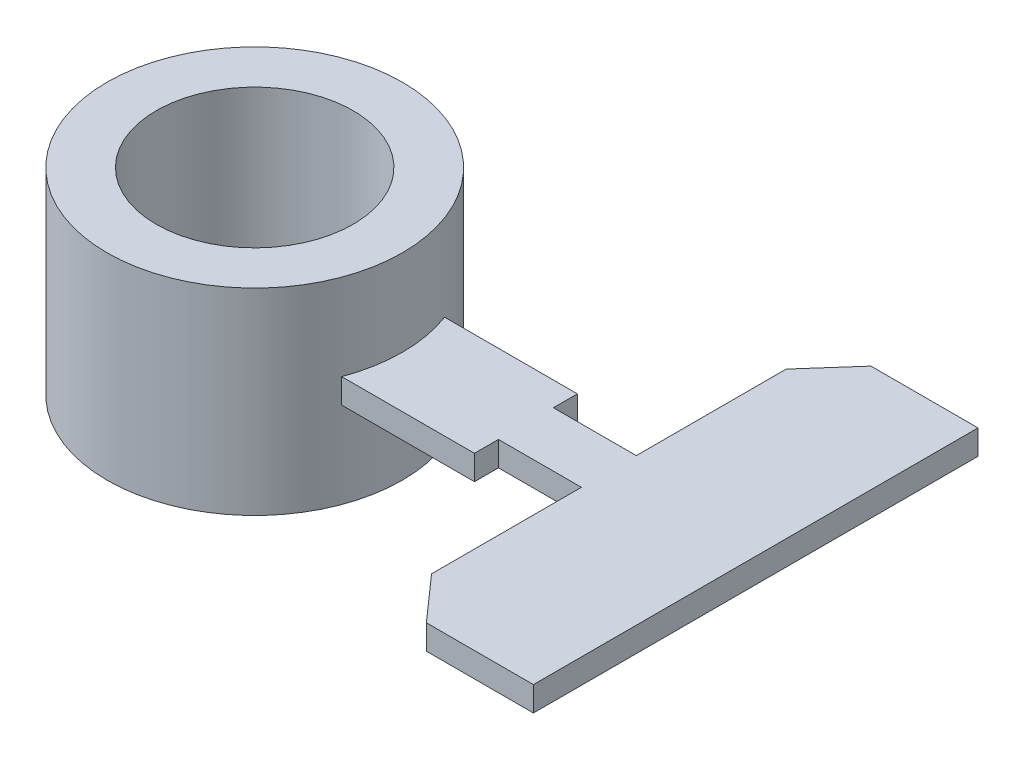
ISO-10303-21;
HEADER;
FILE_DESCRIPTION(('STEP AP214'),'2;1');
FILE_NAME('part.step','',(''),(''),'','','');
FILE_SCHEMA(('AUTOMOTIVE_DESIGN { 1 0 10303 214 1 1 1 1 }'));
ENDSEC;
DATA;
#1=APPLICATION_CONTEXT('core data for automotive mechanical design processes');
#2=APPLICATION_PROTOCOL_DEFINITION('international standard','automotive_design',2000,#1);
#3=PRODUCT_CONTEXT('',#1,'mechanical');
#4=PRODUCT('Part','Part','',(#3));
#5=PRODUCT_RELATED_PRODUCT_CATEGORY('part','',(#4));
#6=PRODUCT_DEFINITION_FORMATION('','',#4);
#7=PRODUCT_DEFINITION_CONTEXT('part definition',#1,'design');
#8=PRODUCT_DEFINITION('design','',#6,#7);
#9=PRODUCT_DEFINITION_SHAPE('','',#8);
#10=(LENGTH_UNIT() NAMED_UNIT(*) SI_UNIT(.MILLI.,.METRE.));
#11=(NAMED_UNIT(*) PLANE_ANGLE_UNIT() SI_UNIT($,.RADIAN.));
#12=(NAMED_UNIT(*) SI_UNIT($,.STERADIAN.) SOLID_ANGLE_UNIT());
#13=UNCERTAINTY_MEASURE_WITH_UNIT(LENGTH_MEASURE(1.E-05),#10,'distance_accuracy_value','');
#14=(GEOMETRIC_REPRESENTATION_CONTEXT(3) GLOBAL_UNCERTAINTY_ASSIGNED_CONTEXT((#13)) GLOBAL_UNIT_ASSIGNED_CONTEXT((#10,
#11,#12)) REPRESENTATION_CONTEXT('',''));
#15=CARTESIAN_POINT('',(0.,0.,0.));
#16=DIRECTION('',(0.,0.,1.));
#17=DIRECTION('',(1.,0.,0.));
#18=AXIS2_PLACEMENT_3D('',#15,#16,#17);
#19=CARTESIAN_POINT('',(0.,20.,0.));
#20=DIRECTION('',(0.,1.,0.));
#21=DIRECTION('',(0.,0.,1.));
#22=AXIS2_PLACEMENT_3D('',#19,#20,#21);
#23=PLANE('',#22);
#24=CARTESIAN_POINT('',(0.,20.,0.));
#25=DIRECTION('',(0.,1.,0.));
#26=DIRECTION('',(0.,0.,1.));
#27=AXIS2_PLACEMENT_3D('',#24,#25,#26);
#28=CIRCLE('',#27,30.);
#29=CARTESIAN_POINT('',(0.,20.,30.));
#30=VERTEX_POINT('',#29);
#31=EDGE_CURVE('E11',#30,#30,#28,.T.);
#32=ORIENTED_EDGE('',*,*,#31,.T.);
#33=EDGE_LOOP('',(#32));
#34=FACE_BOUND('',#33,.T.);
#35=CARTESIAN_POINT('',(0.,20.,0.));
#36=DIRECTION('',(0.,1.,0.));
#37=DIRECTION('',(0.,0.,1.));
#38=AXIS2_PLACEMENT_3D('',#35,#36,#37);
#39=CIRCLE('',#38,20.);
#40=CARTESIAN_POINT('',(0.,20.,20.));
#41=VERTEX_POINT('',#40);
#42=EDGE_CURVE('E287',#41,#41,#39,.T.);
#43=ORIENTED_EDGE('',*,*,#42,.F.);
#44=EDGE_LOOP('',(#43));
#45=FACE_BOUND('',#44,.T.);
#46=ADVANCED_FACE('F39',(#34,#45),#23,.T.);
#47=CARTESIAN_POINT('',(0.,-20.,0.));
#48=DIRECTION('',(0.,1.,0.));
#49=DIRECTION('',(0.,0.,1.));
#50=AXIS2_PLACEMENT_3D('',#47,#48,#49);
#51=PLANE('',#50);
#52=CARTESIAN_POINT('',(0.,-20.,0.));
#53=DIRECTION('',(0.,1.,0.));
#54=DIRECTION('',(0.,0.,1.));
#55=AXIS2_PLACEMENT_3D('',#52,#53,#54);
#56=CIRCLE('',#55,30.);
#57=CARTESIAN_POINT('',(0.,-20.,30.));
#58=VERTEX_POINT('',#57);
#59=EDGE_CURVE('E43',#58,#58,#56,.T.);
#60=ORIENTED_EDGE('',*,*,#59,.F.);
#61=EDGE_LOOP('',(#60));
#62=FACE_BOUND('',#61,.T.);
#63=CARTESIAN_POINT('',(0.,-20.,0.));
#64=DIRECTION('',(0.,1.,0.));
#65=DIRECTION('',(0.,0.,1.));
#66=AXIS2_PLACEMENT_3D('',#63,#64,#65);
#67=CIRCLE('',#66,20.);
#68=CARTESIAN_POINT('',(0.,-20.,20.));
#69=VERTEX_POINT('',#68);
#70=EDGE_CURVE('E286',#69,#69,#67,.T.);
#71=ORIENTED_EDGE('',*,*,#70,.T.);
#72=EDGE_LOOP('',(#71));
#73=FACE_BOUND('',#72,.T.);
#74=ADVANCED_FACE('F295',(#62,#73),#51,.F.);
#75=CARTESIAN_POINT('',(0.,20.,0.));
#76=DIRECTION('',(0.,-1.,0.));
#77=DIRECTION('',(0.,0.,-1.));
#78=AXIS2_PLACEMENT_3D('',#75,#76,#77);
#79=CYLINDRICAL_SURFACE('',#78,30.);
#80=DIRECTION('',(0.,-1.,0.));
#81=VECTOR('',#80,1.);
#82=CARTESIAN_POINT('',(28.1203822972742,2.5,10.4519902150331));
#83=LINE('',#82,#81);
#84=CARTESIAN_POINT('',(28.1203822972742,2.5,10.4519902150331));
#85=VERTEX_POINT('',#84);
#86=CARTESIAN_POINT('',(28.1203822972742,-2.5,10.4519902150331));
#87=VERTEX_POINT('',#86);
#88=EDGE_CURVE('E55',#85,#87,#83,.T.);
#89=ORIENTED_EDGE('',*,*,#88,.F.);
#90=CARTESIAN_POINT('',(0.,2.5,0.));
#91=DIRECTION('',(0.,-1.,0.));
#92=DIRECTION('',(0.,0.,1.));
#93=AXIS2_PLACEMENT_3D('',#90,#91,#92);
#94=CIRCLE('',#93,30.);
#95=CARTESIAN_POINT('',(28.1203822972742,2.5,-10.4519902150331));
#96=VERTEX_POINT('',#95);
#97=EDGE_CURVE('E60',#96,#85,#94,.T.);
#98=ORIENTED_EDGE('',*,*,#97,.F.);
#99=DIRECTION('',(0.,-1.,0.));
#100=VECTOR('',#99,1.);
#101=CARTESIAN_POINT('',(28.1203822972742,2.5,-10.4519902150331));
#102=LINE('',#101,#100);
#103=CARTESIAN_POINT('',(28.1203822972742,-2.5,-10.4519902150331));
#104=VERTEX_POINT('',#103);
#105=EDGE_CURVE('E197',#96,#104,#102,.T.);
#106=ORIENTED_EDGE('',*,*,#105,.T.);
#107=CARTESIAN_POINT('',(0.,-2.5,0.));
#108=DIRECTION('',(0.,-1.,0.));
#109=DIRECTION('',(0.,0.,1.));
#110=AXIS2_PLACEMENT_3D('',#107,#108,#109);
#111=CIRCLE('',#110,30.);
#112=EDGE_CURVE('E198',#104,#87,#111,.T.);
#113=ORIENTED_EDGE('',*,*,#112,.T.);
#114=EDGE_LOOP('',(#89,#98,#106,#113));
#115=FACE_BOUND('',#114,.T.);
#116=ORIENTED_EDGE('',*,*,#31,.F.);
#117=EDGE_LOOP('',(#116));
#118=FACE_BOUND('',#117,.T.);
#119=ORIENTED_EDGE('',*,*,#59,.T.);
#120=EDGE_LOOP('',(#119));
#121=FACE_BOUND('',#120,.T.);
#122=ADVANCED_FACE('F41',(#115,#118,#121),#79,.T.);
#123=CARTESIAN_POINT('',(0.,20.,0.));
#124=DIRECTION('',(0.,-1.,0.));
#125=DIRECTION('',(0.,0.,-1.));
#126=AXIS2_PLACEMENT_3D('',#123,#124,#125);
#127=CYLINDRICAL_SURFACE('',#126,20.);
#128=ORIENTED_EDGE('',*,*,#42,.T.);
#129=EDGE_LOOP('',(#128));
#130=FACE_BOUND('',#129,.T.);
#131=ORIENTED_EDGE('',*,*,#70,.F.);
#132=EDGE_LOOP('',(#131));
#133=FACE_BOUND('',#132,.T.);
#134=ADVANCED_FACE('F297',(#130,#133),#127,.F.);
#135=CARTESIAN_POINT('',(28.1203822972742,2.5,10.4519902150331));
#136=DIRECTION('',(0.,0.,-1.));
#137=DIRECTION('',(-1.,0.,0.));
#138=AXIS2_PLACEMENT_3D('',#135,#136,#137);
#139=PLANE('',#138);
#140=DIRECTION('',(1.,0.,0.));
#141=VECTOR('',#140,1.);
#142=CARTESIAN_POINT('',(28.1203822972742,-2.5,10.4519902150331));
#143=LINE('',#142,#141);
#144=CARTESIAN_POINT('',(55.0803087577025,-2.5,10.4519902150331));
#145=VERTEX_POINT('',#144);
#146=EDGE_CURVE('E151',#87,#145,#143,.T.);
#147=ORIENTED_EDGE('',*,*,#146,.T.);
#148=DIRECTION('',(0.,-1.,0.));
#149=VECTOR('',#148,1.);
#150=CARTESIAN_POINT('',(55.0803087577025,2.5,10.4519902150331));
#151=LINE('',#150,#149);
#152=CARTESIAN_POINT('',(55.0803087577025,2.5,10.4519902150331));
#153=VERTEX_POINT('',#152);
#154=EDGE_CURVE('E148',#153,#145,#151,.T.);
#155=ORIENTED_EDGE('',*,*,#154,.F.);
#156=DIRECTION('',(1.,0.,0.));
#157=VECTOR('',#156,1.);
#158=CARTESIAN_POINT('',(28.1203822972742,2.5,10.4519902150331));
#159=LINE('',#158,#157);
#160=EDGE_CURVE('E138',#85,#153,#159,.T.);
#161=ORIENTED_EDGE('',*,*,#160,.F.);
#162=ORIENTED_EDGE('',*,*,#88,.T.);
#163=EDGE_LOOP('',(#147,#155,#161,#162));
#164=FACE_BOUND('',#163,.T.);
#165=ADVANCED_FACE('F149',(#164),#139,.F.);
#166=CARTESIAN_POINT('',(55.0803087577025,2.5,10.4519902150331));
#167=DIRECTION('',(-1.,0.,0.));
#168=DIRECTION('',(0.,0.,1.));
#169=AXIS2_PLACEMENT_3D('',#166,#167,#168);
#170=PLANE('',#169);
#171=DIRECTION('',(0.,0.,-1.));
#172=VECTOR('',#171,1.);
#173=CARTESIAN_POINT('',(55.0803087577025,-2.5,10.4519902150331));
#174=LINE('',#173,#172);
#175=CARTESIAN_POINT('',(55.0803087577025,-2.5,5.57438273433568));
#176=VERTEX_POINT('',#175);
#177=EDGE_CURVE('E203',#145,#176,#174,.T.);
#178=ORIENTED_EDGE('',*,*,#177,.T.);
#179=DIRECTION('',(0.,-1.,0.));
#180=VECTOR('',#179,1.);
#181=CARTESIAN_POINT('',(55.0803087577025,2.5,5.57438273433568));
#182=LINE('',#181,#180);
#183=CARTESIAN_POINT('',(55.0803087577025,2.5,5.57438273433568));
#184=VERTEX_POINT('',#183);
#185=EDGE_CURVE('E155',#184,#176,#182,.T.);
#186=ORIENTED_EDGE('',*,*,#185,.F.);
#187=DIRECTION('',(0.,0.,-1.));
#188=VECTOR('',#187,1.);
#189=CARTESIAN_POINT('',(55.0803087577025,2.5,10.4519902150331));
#190=LINE('',#189,#188);
#191=EDGE_CURVE('E142',#153,#184,#190,.T.);
#192=ORIENTED_EDGE('',*,*,#191,.F.);
#193=ORIENTED_EDGE('',*,*,#154,.T.);
#194=EDGE_LOOP('',(#178,#186,#192,#193));
#195=FACE_BOUND('',#194,.T.);
#196=ADVANCED_FACE('F157',(#195),#170,.F.);
#197=CARTESIAN_POINT('',(55.0803087577025,2.5,5.57438273433568));
#198=DIRECTION('',(0.,0.,-1.));
#199=DIRECTION('',(-1.,0.,0.));
#200=AXIS2_PLACEMENT_3D('',#197,#198,#199);
#201=PLANE('',#200);
#202=DIRECTION('',(1.,0.,0.));
#203=VECTOR('',#202,1.);
#204=CARTESIAN_POINT('',(55.0803087577025,-2.5,5.57438273433568));
#205=LINE('',#204,#203);
#206=CARTESIAN_POINT('',(71.9192317424928,-2.5,5.57438273433568));
#207=VERTEX_POINT('',#206);
#208=EDGE_CURVE('E206',#176,#207,#205,.T.);
#209=ORIENTED_EDGE('',*,*,#208,.T.);
#210=DIRECTION('',(0.,-1.,0.));
#211=VECTOR('',#210,1.);
#212=CARTESIAN_POINT('',(71.9192317424928,2.5,5.57438273433568));
#213=LINE('',#212,#211);
#214=CARTESIAN_POINT('',(71.9192317424928,2.5,5.57438273433568));
#215=VERTEX_POINT('',#214);
#216=EDGE_CURVE('E278',#215,#207,#213,.T.);
#217=ORIENTED_EDGE('',*,*,#216,.F.);
#218=DIRECTION('',(1.,0.,0.));
#219=VECTOR('',#218,1.);
#220=CARTESIAN_POINT('',(55.0803087577025,2.5,5.57438273433568));
#221=LINE('',#220,#219);
#222=EDGE_CURVE('E161',#184,#215,#221,.T.);
#223=ORIENTED_EDGE('',*,*,#222,.F.);
#224=ORIENTED_EDGE('',*,*,#185,.T.);
#225=EDGE_LOOP('',(#209,#217,#223,#224));
#226=FACE_BOUND('',#225,.T.);
#227=ADVANCED_FACE('F344',(#226),#201,.F.);
#228=CARTESIAN_POINT('',(71.9192317424928,2.5,5.57438273433568));
#229=DIRECTION('',(1.,0.,0.));
#230=DIRECTION('',(0.,0.,-1.));
#231=AXIS2_PLACEMENT_3D('',#228,#229,#230);
#232=PLANE('',#231);
#233=DIRECTION('',(0.,0.,1.));
#234=VECTOR('',#233,1.);
#235=CARTESIAN_POINT('',(71.9192317424928,-2.5,5.57438273433568));
#236=LINE('',#235,#234);
#237=CARTESIAN_POINT('',(71.9192317424928,-2.5,36.0061712610652));
#238=VERTEX_POINT('',#237);
#239=EDGE_CURVE('E209',#207,#238,#236,.T.);
#240=ORIENTED_EDGE('',*,*,#239,.T.);
#241=DIRECTION('',(0.,-1.,0.));
#242=VECTOR('',#241,1.);
#243=CARTESIAN_POINT('',(71.9192317424928,2.5,36.0061712610652));
#244=LINE('',#243,#242);
#245=CARTESIAN_POINT('',(71.9192317424928,2.5,36.0061712610652));
#246=VERTEX_POINT('',#245);
#247=EDGE_CURVE('E274',#246,#238,#244,.T.);
#248=ORIENTED_EDGE('',*,*,#247,.F.);
#249=DIRECTION('',(0.,0.,1.));
#250=VECTOR('',#249,1.);
#251=CARTESIAN_POINT('',(71.9192317424928,2.5,5.57438273433568));
#252=LINE('',#251,#250);
#253=EDGE_CURVE('E164',#215,#246,#252,.T.);
#254=ORIENTED_EDGE('',*,*,#253,.F.);
#255=ORIENTED_EDGE('',*,*,#216,.T.);
#256=EDGE_LOOP('',(#240,#248,#254,#255));
#257=FACE_BOUND('',#256,.T.);
#258=ADVANCED_FACE('F353',(#257),#232,.F.);
#259=CARTESIAN_POINT('',(71.9192317424928,2.5,36.0061712610652));
#260=DIRECTION('',(0.748903247535902,0.,-0.662679353707492));
#261=DIRECTION('',(-0.662679353707492,0.,-0.748903247535902));
#262=AXIS2_PLACEMENT_3D('',#259,#260,#261);
#263=PLANE('',#262);
#264=DIRECTION('',(0.662679353707492,0.,0.748903247535902));
#265=VECTOR('',#264,1.);
#266=CARTESIAN_POINT('',(71.9192317424928,-2.5,36.0061712610652));
#267=LINE('',#266,#265);
#268=CARTESIAN_POINT('',(80.0021867627439,-2.5,45.1408322860179));
#269=VERTEX_POINT('',#268);
#270=EDGE_CURVE('E212',#238,#269,#267,.T.);
#271=ORIENTED_EDGE('',*,*,#270,.T.);
#272=DIRECTION('',(0.,-1.,0.));
#273=VECTOR('',#272,1.);
#274=CARTESIAN_POINT('',(80.0021867627439,2.5,45.1408322860179));
#275=LINE('',#274,#273);
#276=CARTESIAN_POINT('',(80.0021867627439,2.5,45.1408322860179));
#277=VERTEX_POINT('',#276);
#278=EDGE_CURVE('E270',#277,#269,#275,.T.);
#279=ORIENTED_EDGE('',*,*,#278,.F.);
#280=DIRECTION('',(0.662679353707492,0.,0.748903247535902));
#281=VECTOR('',#280,1.);
#282=CARTESIAN_POINT('',(71.9192317424928,2.5,36.0061712610652));
#283=LINE('',#282,#281);
#284=EDGE_CURVE('E170',#246,#277,#283,.T.);
#285=ORIENTED_EDGE('',*,*,#284,.F.);
#286=ORIENTED_EDGE('',*,*,#247,.T.);
#287=EDGE_LOOP('',(#271,#279,#285,#286));
#288=FACE_BOUND('',#287,.T.);
#289=ADVANCED_FACE('F363',(#288),#263,.F.);
#290=CARTESIAN_POINT('',(80.0021867627439,2.5,45.1408322860179));
#291=DIRECTION('',(0.,0.,-1.));
#292=DIRECTION('',(-1.,0.,0.));
#293=AXIS2_PLACEMENT_3D('',#290,#291,#292);
#294=PLANE('',#293);
#295=DIRECTION('',(1.,0.,0.));
#296=VECTOR('',#295,1.);
#297=CARTESIAN_POINT('',(80.0021867627439,-2.5,45.1408322860179));
#298=LINE('',#297,#296);
#299=CARTESIAN_POINT('',(101.742384498688,-2.5,45.1408322860179));
#300=VERTEX_POINT('',#299);
#301=EDGE_CURVE('E215',#269,#300,#298,.T.);
#302=ORIENTED_EDGE('',*,*,#301,.T.);
#303=DIRECTION('',(0.,-1.,0.));
#304=VECTOR('',#303,1.);
#305=CARTESIAN_POINT('',(101.742384498688,2.5,45.1408322860179));
#306=LINE('',#305,#304);
#307=CARTESIAN_POINT('',(101.742384498688,2.5,45.1408322860179));
#308=VERTEX_POINT('',#307);
#309=EDGE_CURVE('E266',#308,#300,#306,.T.);
#310=ORIENTED_EDGE('',*,*,#309,.F.);
#311=DIRECTION('',(1.,0.,0.));
#312=VECTOR('',#311,1.);
#313=CARTESIAN_POINT('',(80.0021867627439,2.5,45.1408322860179));
#314=LINE('',#313,#312);
#315=EDGE_CURVE('E173',#277,#308,#314,.T.);
#316=ORIENTED_EDGE('',*,*,#315,.F.);
#317=ORIENTED_EDGE('',*,*,#278,.T.);
#318=EDGE_LOOP('',(#302,#310,#316,#317));
#319=FACE_BOUND('',#318,.T.);
#320=ADVANCED_FACE('F373',(#319),#294,.F.);
#321=CARTESIAN_POINT('',(101.742384498688,2.5,-45.1408322860179));
#322=DIRECTION('',(-1.,0.,0.));
#323=DIRECTION('',(0.,0.,1.));
#324=AXIS2_PLACEMENT_3D('',#321,#322,#323);
#325=PLANE('',#324);
#326=DIRECTION('',(0.,0.,-1.));
#327=VECTOR('',#326,1.);
#328=CARTESIAN_POINT('',(101.742384498688,-2.5,-45.1408322860179));
#329=LINE('',#328,#327);
#330=CARTESIAN_POINT('',(101.742384498688,-2.5,-45.1408322860179));
#331=VERTEX_POINT('',#330);
#332=EDGE_CURVE('E218',#300,#331,#329,.T.);
#333=ORIENTED_EDGE('',*,*,#332,.T.);
#334=DIRECTION('',(0.,-1.,0.));
#335=VECTOR('',#334,1.);
#336=CARTESIAN_POINT('',(101.742384498688,2.5,-45.1408322860179));
#337=LINE('',#336,#335);
#338=CARTESIAN_POINT('',(101.742384498688,2.5,-45.1408322860179));
#339=VERTEX_POINT('',#338);
#340=EDGE_CURVE('E262',#339,#331,#337,.T.);
#341=ORIENTED_EDGE('',*,*,#340,.F.);
#342=DIRECTION('',(0.,0.,-1.));
#343=VECTOR('',#342,1.);
#344=CARTESIAN_POINT('',(101.742384498688,2.5,-45.1408322860179));
#345=LINE('',#344,#343);
#346=EDGE_CURVE('E176',#308,#339,#345,.T.);
#347=ORIENTED_EDGE('',*,*,#346,.F.);
#348=ORIENTED_EDGE('',*,*,#309,.T.);
#349=EDGE_LOOP('',(#333,#341,#347,#348));
#350=FACE_BOUND('',#349,.T.);
#351=ADVANCED_FACE('F383',(#350),#325,.F.);
#352=CARTESIAN_POINT('',(80.0021867627439,2.5,-45.1408322860179));
#353=DIRECTION('',(0.,0.,1.));
#354=DIRECTION('',(1.,0.,0.));
#355=AXIS2_PLACEMENT_3D('',#352,#353,#354);
#356=PLANE('',#355);
#357=DIRECTION('',(-1.,0.,0.));
#358=VECTOR('',#357,1.);
#359=CARTESIAN_POINT('',(80.0021867627439,-2.5,-45.1408322860179));
#360=LINE('',#359,#358);
#361=CARTESIAN_POINT('',(80.0021867627439,-2.5,-45.1408322860179));
#362=VERTEX_POINT('',#361);
#363=EDGE_CURVE('E221',#331,#362,#360,.T.);
#364=ORIENTED_EDGE('',*,*,#363,.T.);
#365=DIRECTION('',(0.,-1.,0.));
#366=VECTOR('',#365,1.);
#367=CARTESIAN_POINT('',(80.0021867627439,2.5,-45.1408322860179));
#368=LINE('',#367,#366);
#369=CARTESIAN_POINT('',(80.0021867627439,2.5,-45.1408322860179));
#370=VERTEX_POINT('',#369);
#371=EDGE_CURVE('E258',#370,#362,#368,.T.);
#372=ORIENTED_EDGE('',*,*,#371,.F.);
#373=DIRECTION('',(-1.,0.,0.));
#374=VECTOR('',#373,1.);
#375=CARTESIAN_POINT('',(80.0021867627439,2.5,-45.1408322860179));
#376=LINE('',#375,#374);
#377=EDGE_CURVE('E179',#339,#370,#376,.T.);
#378=ORIENTED_EDGE('',*,*,#377,.F.);
#379=ORIENTED_EDGE('',*,*,#340,.T.);
#380=EDGE_LOOP('',(#364,#372,#378,#379));
#381=FACE_BOUND('',#380,.T.);
#382=ADVANCED_FACE('F393',(#381),#356,.F.);
#383=CARTESIAN_POINT('',(71.9192317424928,2.5,-36.0061712610652));
#384=DIRECTION('',(0.748903247535902,0.,0.662679353707492));
#385=DIRECTION('',(0.662679353707492,0.,-0.748903247535902));
#386=AXIS2_PLACEMENT_3D('',#383,#384,#385);
#387=PLANE('',#386);
#388=DIRECTION('',(-0.662679353707492,0.,0.748903247535902));
#389=VECTOR('',#388,1.);
#390=CARTESIAN_POINT('',(71.9192317424928,-2.5,-36.0061712610652));
#391=LINE('',#390,#389);
#392=CARTESIAN_POINT('',(71.9192317424928,-2.5,-36.0061712610652));
#393=VERTEX_POINT('',#392);
#394=EDGE_CURVE('E224',#362,#393,#391,.T.);
#395=ORIENTED_EDGE('',*,*,#394,.T.);
#396=DIRECTION('',(0.,-1.,0.));
#397=VECTOR('',#396,1.);
#398=CARTESIAN_POINT('',(71.9192317424928,2.5,-36.0061712610652));
#399=LINE('',#398,#397);
#400=CARTESIAN_POINT('',(71.9192317424928,2.5,-36.0061712610652));
#401=VERTEX_POINT('',#400);
#402=EDGE_CURVE('E254',#401,#393,#399,.T.);
#403=ORIENTED_EDGE('',*,*,#402,.F.);
#404=DIRECTION('',(-0.662679353707492,0.,0.748903247535902));
#405=VECTOR('',#404,1.);
#406=CARTESIAN_POINT('',(71.9192317424928,2.5,-36.0061712610652));
#407=LINE('',#406,#405);
#408=EDGE_CURVE('E182',#370,#401,#407,.T.);
#409=ORIENTED_EDGE('',*,*,#408,.F.);
#410=ORIENTED_EDGE('',*,*,#371,.T.);
#411=EDGE_LOOP('',(#395,#403,#409,#410));
#412=FACE_BOUND('',#411,.T.);
#413=ADVANCED_FACE('F403',(#412),#387,.F.);
#414=CARTESIAN_POINT('',(71.9192317424928,2.5,-5.57438273433568));
#415=DIRECTION('',(1.,0.,0.));
#416=DIRECTION('',(0.,0.,-1.));
#417=AXIS2_PLACEMENT_3D('',#414,#415,#416);
#418=PLANE('',#417);
#419=DIRECTION('',(0.,0.,1.));
#420=VECTOR('',#419,1.);
#421=CARTESIAN_POINT('',(71.9192317424928,-2.5,-5.57438273433568));
#422=LINE('',#421,#420);
#423=CARTESIAN_POINT('',(71.9192317424928,-2.5,-5.57438273433568));
#424=VERTEX_POINT('',#423);
#425=EDGE_CURVE('E227',#393,#424,#422,.T.);
#426=ORIENTED_EDGE('',*,*,#425,.T.);
#427=DIRECTION('',(0.,-1.,0.));
#428=VECTOR('',#427,1.);
#429=CARTESIAN_POINT('',(71.9192317424928,2.5,-5.57438273433568));
#430=LINE('',#429,#428);
#431=CARTESIAN_POINT('',(71.9192317424928,2.5,-5.57438273433568));
#432=VERTEX_POINT('',#431);
#433=EDGE_CURVE('E250',#432,#424,#430,.T.);
#434=ORIENTED_EDGE('',*,*,#433,.F.);
#435=DIRECTION('',(0.,0.,1.));
#436=VECTOR('',#435,1.);
#437=CARTESIAN_POINT('',(71.9192317424928,2.5,-5.57438273433568));
#438=LINE('',#437,#436);
#439=EDGE_CURVE('E185',#401,#432,#438,.T.);
#440=ORIENTED_EDGE('',*,*,#439,.F.);
#441=ORIENTED_EDGE('',*,*,#402,.T.);
#442=EDGE_LOOP('',(#426,#434,#440,#441));
#443=FACE_BOUND('',#442,.T.);
#444=ADVANCED_FACE('F413',(#443),#418,.F.);
#445=CARTESIAN_POINT('',(55.0803087577025,2.5,-5.57438273433568));
#446=DIRECTION('',(0.,0.,1.));
#447=DIRECTION('',(1.,0.,0.));
#448=AXIS2_PLACEMENT_3D('',#445,#446,#447);
#449=PLANE('',#448);
#450=DIRECTION('',(-1.,0.,0.));
#451=VECTOR('',#450,1.);
#452=CARTESIAN_POINT('',(55.0803087577025,-2.5,-5.57438273433568));
#453=LINE('',#452,#451);
#454=CARTESIAN_POINT('',(55.0803087577025,-2.5,-5.57438273433568));
#455=VERTEX_POINT('',#454);
#456=EDGE_CURVE('E230',#424,#455,#453,.T.);
#457=ORIENTED_EDGE('',*,*,#456,.T.);
#458=DIRECTION('',(0.,-1.,0.));
#459=VECTOR('',#458,1.);
#460=CARTESIAN_POINT('',(55.0803087577025,2.5,-5.57438273433568));
#461=LINE('',#460,#459);
#462=CARTESIAN_POINT('',(55.0803087577025,2.5,-5.57438273433568));
#463=VERTEX_POINT('',#462);
#464=EDGE_CURVE('E246',#463,#455,#461,.T.);
#465=ORIENTED_EDGE('',*,*,#464,.F.);
#466=DIRECTION('',(-1.,0.,0.));
#467=VECTOR('',#466,1.);
#468=CARTESIAN_POINT('',(55.0803087577025,2.5,-5.57438273433568));
#469=LINE('',#468,#467);
#470=EDGE_CURVE('E188',#432,#463,#469,.T.);
#471=ORIENTED_EDGE('',*,*,#470,.F.);
#472=ORIENTED_EDGE('',*,*,#433,.T.);
#473=EDGE_LOOP('',(#457,#465,#471,#472));
#474=FACE_BOUND('',#473,.T.);
#475=ADVANCED_FACE('F423',(#474),#449,.F.);
#476=CARTESIAN_POINT('',(55.0803087577025,2.5,-10.4519902150331));
#477=DIRECTION('',(-1.,0.,0.));
#478=DIRECTION('',(0.,0.,1.));
#479=AXIS2_PLACEMENT_3D('',#476,#477,#478);
#480=PLANE('',#479);
#481=DIRECTION('',(0.,0.,-1.));
#482=VECTOR('',#481,1.);
#483=CARTESIAN_POINT('',(55.0803087577025,-2.5,-10.4519902150331));
#484=LINE('',#483,#482);
#485=CARTESIAN_POINT('',(55.0803087577025,-2.5,-10.4519902150331));
#486=VERTEX_POINT('',#485);
#487=EDGE_CURVE('E233',#455,#486,#484,.T.);
#488=ORIENTED_EDGE('',*,*,#487,.T.);
#489=DIRECTION('',(0.,-1.,0.));
#490=VECTOR('',#489,1.);
#491=CARTESIAN_POINT('',(55.0803087577025,2.5,-10.4519902150331));
#492=LINE('',#491,#490);
#493=CARTESIAN_POINT('',(55.0803087577025,2.5,-10.4519902150331));
#494=VERTEX_POINT('',#493);
#495=EDGE_CURVE('E242',#494,#486,#492,.T.);
#496=ORIENTED_EDGE('',*,*,#495,.F.);
#497=DIRECTION('',(0.,0.,-1.));
#498=VECTOR('',#497,1.);
#499=CARTESIAN_POINT('',(55.0803087577025,2.5,-10.4519902150331));
#500=LINE('',#499,#498);
#501=EDGE_CURVE('E191',#463,#494,#500,.T.);
#502=ORIENTED_EDGE('',*,*,#501,.F.);
#503=ORIENTED_EDGE('',*,*,#464,.T.);
#504=EDGE_LOOP('',(#488,#496,#502,#503));
#505=FACE_BOUND('',#504,.T.);
#506=ADVANCED_FACE('F433',(#505),#480,.F.);
#507=CARTESIAN_POINT('',(28.1203822972742,2.5,-10.4519902150331));
#508=DIRECTION('',(0.,0.,1.));
#509=DIRECTION('',(1.,0.,0.));
#510=AXIS2_PLACEMENT_3D('',#507,#508,#509);
#511=PLANE('',#510);
#512=DIRECTION('',(-1.,0.,0.));
#513=VECTOR('',#512,1.);
#514=CARTESIAN_POINT('',(28.1203822972742,-2.5,-10.4519902150331));
#515=LINE('',#514,#513);
#516=EDGE_CURVE('E236',#486,#104,#515,.T.);
#517=ORIENTED_EDGE('',*,*,#516,.T.);
#518=ORIENTED_EDGE('',*,*,#105,.F.);
#519=DIRECTION('',(-1.,0.,0.));
#520=VECTOR('',#519,1.);
#521=CARTESIAN_POINT('',(28.1203822972742,2.5,-10.4519902150331));
#522=LINE('',#521,#520);
#523=EDGE_CURVE('E194',#494,#96,#522,.T.);
#524=ORIENTED_EDGE('',*,*,#523,.F.);
#525=ORIENTED_EDGE('',*,*,#495,.T.);
#526=EDGE_LOOP('',(#517,#518,#524,#525));
#527=FACE_BOUND('',#526,.T.);
#528=ADVANCED_FACE('F443',(#527),#511,.F.);
#529=CARTESIAN_POINT('',(0.,2.5,0.));
#530=DIRECTION('',(0.,1.,0.));
#531=DIRECTION('',(0.,0.,1.));
#532=AXIS2_PLACEMENT_3D('',#529,#530,#531);
#533=PLANE('',#532);
#534=ORIENTED_EDGE('',*,*,#97,.T.);
#535=ORIENTED_EDGE('',*,*,#160,.T.);
#536=ORIENTED_EDGE('',*,*,#191,.T.);
#537=ORIENTED_EDGE('',*,*,#222,.T.);
#538=ORIENTED_EDGE('',*,*,#253,.T.);
#539=ORIENTED_EDGE('',*,*,#284,.T.);
#540=ORIENTED_EDGE('',*,*,#315,.T.);
#541=ORIENTED_EDGE('',*,*,#346,.T.);
#542=ORIENTED_EDGE('',*,*,#377,.T.);
#543=ORIENTED_EDGE('',*,*,#408,.T.);
#544=ORIENTED_EDGE('',*,*,#439,.T.);
#545=ORIENTED_EDGE('',*,*,#470,.T.);
#546=ORIENTED_EDGE('',*,*,#501,.T.);
#547=ORIENTED_EDGE('',*,*,#523,.T.);
#548=EDGE_LOOP('',(#534,#535,#536,#537,#538,#539,#540,#541,#542,#543,#544,#545,#546,#547));
#549=FACE_BOUND('',#548,.T.);
#550=ADVANCED_FACE('F140',(#549),#533,.T.);
#551=CARTESIAN_POINT('',(0.,-2.5,0.));
#552=DIRECTION('',(0.,1.,0.));
#553=DIRECTION('',(0.,0.,1.));
#554=AXIS2_PLACEMENT_3D('',#551,#552,#553);
#555=PLANE('',#554);
#556=ORIENTED_EDGE('',*,*,#112,.F.);
#557=ORIENTED_EDGE('',*,*,#516,.F.);
#558=ORIENTED_EDGE('',*,*,#487,.F.);
#559=ORIENTED_EDGE('',*,*,#456,.F.);
#560=ORIENTED_EDGE('',*,*,#425,.F.);
#561=ORIENTED_EDGE('',*,*,#394,.F.);
#562=ORIENTED_EDGE('',*,*,#363,.F.);
#563=ORIENTED_EDGE('',*,*,#332,.F.);
#564=ORIENTED_EDGE('',*,*,#301,.F.);
#565=ORIENTED_EDGE('',*,*,#270,.F.);
#566=ORIENTED_EDGE('',*,*,#239,.F.);
#567=ORIENTED_EDGE('',*,*,#208,.F.);
#568=ORIENTED_EDGE('',*,*,#177,.F.);
#569=ORIENTED_EDGE('',*,*,#146,.F.);
#570=EDGE_LOOP('',(#556,#557,#558,#559,#560,#561,#562,#563,#564,#565,#566,#567,#568,#569));
#571=FACE_BOUND('',#570,.T.);
#572=ADVANCED_FACE('F462',(#571),#555,.F.);
#573=CLOSED_SHELL('',(#46,#74,#122,#134,#165,#196,#227,#258,#289,#320,#351,#382,#413,#444,#475,
#506,#528,#550,#572));
#574=MANIFOLD_SOLID_BREP('B2',#573);
#575=ADVANCED_BREP_SHAPE_REPRESENTATION('',(#18,#574),#14);
#576=SHAPE_DEFINITION_REPRESENTATION(#9,#575);
ENDSEC;
END-ISO-10303-21;
